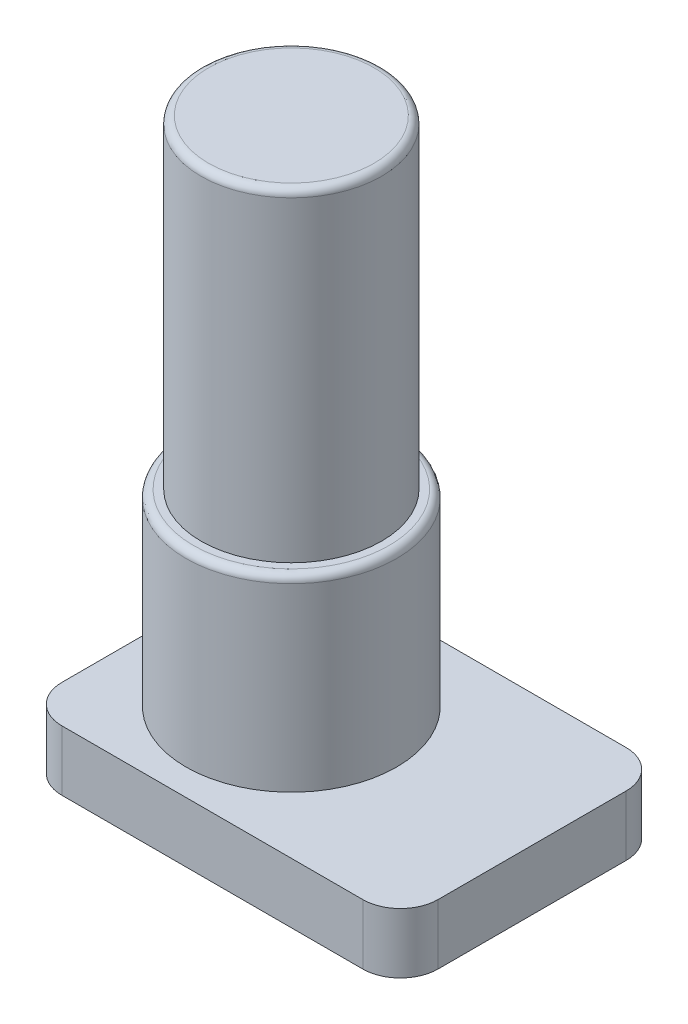
ISO-10303-21;
HEADER;
FILE_DESCRIPTION(('STEP AP214'),'2;1');
FILE_NAME('part.step','',(''),(''),'','','');
FILE_SCHEMA(('AUTOMOTIVE_DESIGN { 1 0 10303 214 1 1 1 1 }'));
ENDSEC;
DATA;
#1=APPLICATION_CONTEXT('core data for automotive mechanical design processes');
#2=APPLICATION_PROTOCOL_DEFINITION('international standard','automotive_design',2000,#1);
#3=PRODUCT_CONTEXT('',#1,'mechanical');
#4=PRODUCT('Part','Part','',(#3));
#5=PRODUCT_RELATED_PRODUCT_CATEGORY('part','',(#4));
#6=PRODUCT_DEFINITION_FORMATION('','',#4);
#7=PRODUCT_DEFINITION_CONTEXT('part definition',#1,'design');
#8=PRODUCT_DEFINITION('design','',#6,#7);
#9=PRODUCT_DEFINITION_SHAPE('','',#8);
#10=(LENGTH_UNIT() NAMED_UNIT(*) SI_UNIT(.MILLI.,.METRE.));
#11=(NAMED_UNIT(*) PLANE_ANGLE_UNIT() SI_UNIT($,.RADIAN.));
#12=(NAMED_UNIT(*) SI_UNIT($,.STERADIAN.) SOLID_ANGLE_UNIT());
#13=UNCERTAINTY_MEASURE_WITH_UNIT(LENGTH_MEASURE(1.E-05),#10,'distance_accuracy_value','');
#14=(GEOMETRIC_REPRESENTATION_CONTEXT(3) GLOBAL_UNCERTAINTY_ASSIGNED_CONTEXT((#13)) GLOBAL_UNIT_ASSIGNED_CONTEXT((#10,
#11,#12)) REPRESENTATION_CONTEXT('',''));
#15=CARTESIAN_POINT('',(0.,0.,0.));
#16=DIRECTION('',(0.,0.,1.));
#17=DIRECTION('',(1.,0.,0.));
#18=AXIS2_PLACEMENT_3D('',#15,#16,#17);
#19=CARTESIAN_POINT('',(25.,8.,-17.5));
#20=DIRECTION('',(-1.,0.,0.));
#21=DIRECTION('',(0.,0.,1.));
#22=AXIS2_PLACEMENT_3D('',#19,#20,#21);
#23=PLANE('',#22);
#24=DIRECTION('',(0.,0.,-1.));
#25=VECTOR('',#24,1.);
#26=CARTESIAN_POINT('',(25.,0.,-17.5));
#27=LINE('',#26,#25);
#28=CARTESIAN_POINT('',(25.,0.,12.5));
#29=VERTEX_POINT('',#28);
#30=CARTESIAN_POINT('',(25.,0.,-12.5));
#31=VERTEX_POINT('',#30);
#32=EDGE_CURVE('E131',#29,#31,#27,.T.);
#33=ORIENTED_EDGE('',*,*,#32,.T.);
#34=DIRECTION('',(0.,-1.,0.));
#35=VECTOR('',#34,1.);
#36=CARTESIAN_POINT('',(25.,8.,-12.5));
#37=LINE('',#36,#35);
#38=CARTESIAN_POINT('',(25.,8.,-12.5));
#39=VERTEX_POINT('',#38);
#40=EDGE_CURVE('E158',#31,#39,#37,.F.);
#41=ORIENTED_EDGE('',*,*,#40,.T.);
#42=DIRECTION('',(0.,0.,-1.));
#43=VECTOR('',#42,1.);
#44=CARTESIAN_POINT('',(25.,8.,-17.5));
#45=LINE('',#44,#43);
#46=CARTESIAN_POINT('',(25.,8.,12.5));
#47=VERTEX_POINT('',#46);
#48=EDGE_CURVE('E129',#47,#39,#45,.T.);
#49=ORIENTED_EDGE('',*,*,#48,.F.);
#50=DIRECTION('',(0.,-1.,0.));
#51=VECTOR('',#50,1.);
#52=CARTESIAN_POINT('',(25.,8.,12.5));
#53=LINE('',#52,#51);
#54=EDGE_CURVE('E155',#47,#29,#53,.T.);
#55=ORIENTED_EDGE('',*,*,#54,.T.);
#56=EDGE_LOOP('',(#33,#41,#49,#55));
#57=FACE_BOUND('',#56,.T.);
#58=ADVANCED_FACE('F34',(#57),#23,.F.);
#59=CARTESIAN_POINT('',(-25.,8.,-17.5));
#60=DIRECTION('',(0.,0.,1.));
#61=DIRECTION('',(1.,0.,0.));
#62=AXIS2_PLACEMENT_3D('',#59,#60,#61);
#63=PLANE('',#62);
#64=DIRECTION('',(-1.,0.,0.));
#65=VECTOR('',#64,1.);
#66=CARTESIAN_POINT('',(-25.,0.,-17.5));
#67=LINE('',#66,#65);
#68=CARTESIAN_POINT('',(20.,0.,-17.5));
#69=VERTEX_POINT('',#68);
#70=CARTESIAN_POINT('',(-20.,0.,-17.5));
#71=VERTEX_POINT('',#70);
#72=EDGE_CURVE('E127',#69,#71,#67,.T.);
#73=ORIENTED_EDGE('',*,*,#72,.T.);
#74=DIRECTION('',(0.,-1.,0.));
#75=VECTOR('',#74,1.);
#76=CARTESIAN_POINT('',(-20.,8.,-17.5));
#77=LINE('',#76,#75);
#78=CARTESIAN_POINT('',(-20.,8.,-17.5));
#79=VERTEX_POINT('',#78);
#80=EDGE_CURVE('E106',#71,#79,#77,.F.);
#81=ORIENTED_EDGE('',*,*,#80,.T.);
#82=DIRECTION('',(-1.,0.,0.));
#83=VECTOR('',#82,1.);
#84=CARTESIAN_POINT('',(-25.,8.,-17.5));
#85=LINE('',#84,#83);
#86=CARTESIAN_POINT('',(20.,8.,-17.5));
#87=VERTEX_POINT('',#86);
#88=EDGE_CURVE('E215',#87,#79,#85,.T.);
#89=ORIENTED_EDGE('',*,*,#88,.F.);
#90=DIRECTION('',(0.,-1.,0.));
#91=VECTOR('',#90,1.);
#92=CARTESIAN_POINT('',(20.,8.,-17.5));
#93=LINE('',#92,#91);
#94=EDGE_CURVE('E111',#87,#69,#93,.T.);
#95=ORIENTED_EDGE('',*,*,#94,.T.);
#96=EDGE_LOOP('',(#73,#81,#89,#95));
#97=FACE_BOUND('',#96,.T.);
#98=ADVANCED_FACE('F180',(#97),#63,.F.);
#99=CARTESIAN_POINT('',(-25.,8.,-17.5));
#100=DIRECTION('',(1.,0.,0.));
#101=DIRECTION('',(0.,0.,-1.));
#102=AXIS2_PLACEMENT_3D('',#99,#100,#101);
#103=PLANE('',#102);
#104=DIRECTION('',(0.,0.,1.));
#105=VECTOR('',#104,1.);
#106=CARTESIAN_POINT('',(-25.,8.,-17.5));
#107=LINE('',#106,#105);
#108=CARTESIAN_POINT('',(-25.,8.,-12.5));
#109=VERTEX_POINT('',#108);
#110=CARTESIAN_POINT('',(-25.,8.,12.5));
#111=VERTEX_POINT('',#110);
#112=EDGE_CURVE('E120',#109,#111,#107,.T.);
#113=ORIENTED_EDGE('',*,*,#112,.F.);
#114=DIRECTION('',(0.,-1.,0.));
#115=VECTOR('',#114,1.);
#116=CARTESIAN_POINT('',(-25.,8.,-12.5));
#117=LINE('',#116,#115);
#118=CARTESIAN_POINT('',(-25.,0.,-12.5));
#119=VERTEX_POINT('',#118);
#120=EDGE_CURVE('E105',#109,#119,#117,.T.);
#121=ORIENTED_EDGE('',*,*,#120,.T.);
#122=DIRECTION('',(0.,0.,1.));
#123=VECTOR('',#122,1.);
#124=CARTESIAN_POINT('',(-25.,0.,-17.5));
#125=LINE('',#124,#123);
#126=CARTESIAN_POINT('',(-25.,0.,12.5));
#127=VERTEX_POINT('',#126);
#128=EDGE_CURVE('E118',#119,#127,#125,.T.);
#129=ORIENTED_EDGE('',*,*,#128,.T.);
#130=DIRECTION('',(0.,-1.,0.));
#131=VECTOR('',#130,1.);
#132=CARTESIAN_POINT('',(-25.,8.,12.5));
#133=LINE('',#132,#131);
#134=EDGE_CURVE('E122',#127,#111,#133,.F.);
#135=ORIENTED_EDGE('',*,*,#134,.T.);
#136=EDGE_LOOP('',(#113,#121,#129,#135));
#137=FACE_BOUND('',#136,.T.);
#138=ADVANCED_FACE('F117',(#137),#103,.F.);
#139=CARTESIAN_POINT('',(-25.,8.,17.5));
#140=DIRECTION('',(0.,0.,-1.));
#141=DIRECTION('',(-1.,0.,0.));
#142=AXIS2_PLACEMENT_3D('',#139,#140,#141);
#143=PLANE('',#142);
#144=DIRECTION('',(1.,0.,0.));
#145=VECTOR('',#144,1.);
#146=CARTESIAN_POINT('',(-25.,8.,17.5));
#147=LINE('',#146,#145);
#148=CARTESIAN_POINT('',(-20.,8.,17.5));
#149=VERTEX_POINT('',#148);
#150=CARTESIAN_POINT('',(20.,8.,17.5));
#151=VERTEX_POINT('',#150);
#152=EDGE_CURVE('E212',#149,#151,#147,.T.);
#153=ORIENTED_EDGE('',*,*,#152,.F.);
#154=DIRECTION('',(0.,-1.,0.));
#155=VECTOR('',#154,1.);
#156=CARTESIAN_POINT('',(-20.,8.,17.5));
#157=LINE('',#156,#155);
#158=CARTESIAN_POINT('',(-20.,0.,17.5));
#159=VERTEX_POINT('',#158);
#160=EDGE_CURVE('E152',#149,#159,#157,.T.);
#161=ORIENTED_EDGE('',*,*,#160,.T.);
#162=DIRECTION('',(1.,0.,0.));
#163=VECTOR('',#162,1.);
#164=CARTESIAN_POINT('',(-25.,0.,17.5));
#165=LINE('',#164,#163);
#166=CARTESIAN_POINT('',(20.,0.,17.5));
#167=VERTEX_POINT('',#166);
#168=EDGE_CURVE('E126',#159,#167,#165,.T.);
#169=ORIENTED_EDGE('',*,*,#168,.T.);
#170=DIRECTION('',(0.,-1.,0.));
#171=VECTOR('',#170,1.);
#172=CARTESIAN_POINT('',(20.,8.,17.5));
#173=LINE('',#172,#171);
#174=EDGE_CURVE('E49',#167,#151,#173,.F.);
#175=ORIENTED_EDGE('',*,*,#174,.T.);
#176=EDGE_LOOP('',(#153,#161,#169,#175));
#177=FACE_BOUND('',#176,.T.);
#178=ADVANCED_FACE('F226',(#177),#143,.F.);
#179=CARTESIAN_POINT('',(0.,8.,0.));
#180=DIRECTION('',(0.,1.,0.));
#181=DIRECTION('',(0.,0.,1.));
#182=AXIS2_PLACEMENT_3D('',#179,#180,#181);
#183=PLANE('',#182);
#184=CARTESIAN_POINT('',(-6.99999999999999,8.,0.));
#185=DIRECTION('',(0.,1.,0.));
#186=DIRECTION('',(0.,0.,1.));
#187=AXIS2_PLACEMENT_3D('',#184,#185,#186);
#188=CIRCLE('',#187,14.);
#189=CARTESIAN_POINT('',(-6.99999999999999,8.,14.));
#190=VERTEX_POINT('',#189);
#191=EDGE_CURVE('E219',#190,#190,#188,.T.);
#192=ORIENTED_EDGE('',*,*,#191,.F.);
#193=EDGE_LOOP('',(#192));
#194=FACE_BOUND('',#193,.T.);
#195=ORIENTED_EDGE('',*,*,#88,.T.);
#196=CARTESIAN_POINT('',(-20.,8.,-12.5));
#197=DIRECTION('',(0.,1.,0.));
#198=DIRECTION('',(0.,0.,1.));
#199=AXIS2_PLACEMENT_3D('',#196,#197,#198);
#200=CIRCLE('',#199,5.);
#201=EDGE_CURVE('E149',#79,#109,#200,.T.);
#202=ORIENTED_EDGE('',*,*,#201,.T.);
#203=ORIENTED_EDGE('',*,*,#112,.T.);
#204=CARTESIAN_POINT('',(-20.,8.,12.5));
#205=DIRECTION('',(0.,1.,0.));
#206=DIRECTION('',(0.,0.,1.));
#207=AXIS2_PLACEMENT_3D('',#204,#205,#206);
#208=CIRCLE('',#207,5.);
#209=EDGE_CURVE('E56',#111,#149,#208,.T.);
#210=ORIENTED_EDGE('',*,*,#209,.T.);
#211=ORIENTED_EDGE('',*,*,#152,.T.);
#212=CARTESIAN_POINT('',(20.,8.,12.5));
#213=DIRECTION('',(0.,1.,0.));
#214=DIRECTION('',(0.,0.,1.));
#215=AXIS2_PLACEMENT_3D('',#212,#213,#214);
#216=CIRCLE('',#215,5.);
#217=EDGE_CURVE('E144',#151,#47,#216,.T.);
#218=ORIENTED_EDGE('',*,*,#217,.T.);
#219=ORIENTED_EDGE('',*,*,#48,.T.);
#220=CARTESIAN_POINT('',(20.,8.,-12.5));
#221=DIRECTION('',(0.,1.,0.));
#222=DIRECTION('',(0.,0.,1.));
#223=AXIS2_PLACEMENT_3D('',#220,#221,#222);
#224=CIRCLE('',#223,5.);
#225=EDGE_CURVE('E146',#39,#87,#224,.T.);
#226=ORIENTED_EDGE('',*,*,#225,.T.);
#227=EDGE_LOOP('',(#195,#202,#203,#210,#211,#218,#219,#226));
#228=FACE_BOUND('',#227,.T.);
#229=ADVANCED_FACE('F210',(#194,#228),#183,.T.);
#230=CARTESIAN_POINT('',(0.,0.,0.));
#231=DIRECTION('',(0.,1.,0.));
#232=DIRECTION('',(0.,0.,1.));
#233=AXIS2_PLACEMENT_3D('',#230,#231,#232);
#234=PLANE('',#233);
#235=ORIENTED_EDGE('',*,*,#128,.F.);
#236=CARTESIAN_POINT('',(-20.,0.,-12.5));
#237=DIRECTION('',(0.,1.,0.));
#238=DIRECTION('',(0.,0.,1.));
#239=AXIS2_PLACEMENT_3D('',#236,#237,#238);
#240=CIRCLE('',#239,5.);
#241=EDGE_CURVE('E101',#119,#71,#240,.F.);
#242=ORIENTED_EDGE('',*,*,#241,.T.);
#243=ORIENTED_EDGE('',*,*,#72,.F.);
#244=CARTESIAN_POINT('',(20.,0.,-12.5));
#245=DIRECTION('',(0.,1.,0.));
#246=DIRECTION('',(0.,0.,1.));
#247=AXIS2_PLACEMENT_3D('',#244,#245,#246);
#248=CIRCLE('',#247,5.);
#249=EDGE_CURVE('E138',#69,#31,#248,.F.);
#250=ORIENTED_EDGE('',*,*,#249,.T.);
#251=ORIENTED_EDGE('',*,*,#32,.F.);
#252=CARTESIAN_POINT('',(20.,0.,12.5));
#253=DIRECTION('',(0.,1.,0.));
#254=DIRECTION('',(0.,0.,1.));
#255=AXIS2_PLACEMENT_3D('',#252,#253,#254);
#256=CIRCLE('',#255,5.);
#257=EDGE_CURVE('E121',#29,#167,#256,.F.);
#258=ORIENTED_EDGE('',*,*,#257,.T.);
#259=ORIENTED_EDGE('',*,*,#168,.F.);
#260=CARTESIAN_POINT('',(-20.,0.,12.5));
#261=DIRECTION('',(0.,1.,0.));
#262=DIRECTION('',(0.,0.,1.));
#263=AXIS2_PLACEMENT_3D('',#260,#261,#262);
#264=CIRCLE('',#263,5.);
#265=EDGE_CURVE('E112',#159,#127,#264,.F.);
#266=ORIENTED_EDGE('',*,*,#265,.T.);
#267=EDGE_LOOP('',(#235,#242,#243,#250,#251,#258,#259,#266));
#268=FACE_BOUND('',#267,.T.);
#269=ADVANCED_FACE('F124',(#268),#234,.F.);
#270=CARTESIAN_POINT('',(-6.99999999999999,33.,0.));
#271=DIRECTION('',(0.,-1.,0.));
#272=DIRECTION('',(0.,0.,-1.));
#273=AXIS2_PLACEMENT_3D('',#270,#271,#272);
#274=CYLINDRICAL_SURFACE('',#273,14.);
#275=CARTESIAN_POINT('',(-6.99999999999999,32.,0.));
#276=DIRECTION('',(0.,1.,0.));
#277=DIRECTION('',(0.,0.,1.));
#278=AXIS2_PLACEMENT_3D('',#275,#276,#277);
#279=CIRCLE('',#278,14.);
#280=CARTESIAN_POINT('',(-6.99999999999999,32.,14.));
#281=VERTEX_POINT('',#280);
#282=EDGE_CURVE('E163',#281,#281,#279,.F.);
#283=ORIENTED_EDGE('',*,*,#282,.T.);
#284=EDGE_LOOP('',(#283));
#285=FACE_BOUND('',#284,.T.);
#286=ORIENTED_EDGE('',*,*,#191,.T.);
#287=EDGE_LOOP('',(#286));
#288=FACE_BOUND('',#287,.T.);
#289=ADVANCED_FACE('F237',(#285,#288),#274,.T.);
#290=CARTESIAN_POINT('',(-6.99999999999999,33.,0.));
#291=DIRECTION('',(0.,1.,0.));
#292=DIRECTION('',(0.,0.,1.));
#293=AXIS2_PLACEMENT_3D('',#290,#291,#292);
#294=PLANE('',#293);
#295=CARTESIAN_POINT('',(-6.99999999999999,33.,0.));
#296=DIRECTION('',(0.,1.,0.));
#297=DIRECTION('',(0.,0.,1.));
#298=AXIS2_PLACEMENT_3D('',#295,#296,#297);
#299=CIRCLE('',#298,13.);
#300=CARTESIAN_POINT('',(-6.99999999999999,33.,13.));
#301=VERTEX_POINT('',#300);
#302=EDGE_CURVE('E160',#301,#301,#299,.T.);
#303=ORIENTED_EDGE('',*,*,#302,.T.);
#304=EDGE_LOOP('',(#303));
#305=FACE_BOUND('',#304,.T.);
#306=CARTESIAN_POINT('',(-6.99999999999999,33.,0.));
#307=DIRECTION('',(0.,1.,0.));
#308=DIRECTION('',(0.,0.,1.));
#309=AXIS2_PLACEMENT_3D('',#306,#307,#308);
#310=CIRCLE('',#309,12.);
#311=CARTESIAN_POINT('',(-6.99999999999999,33.,12.));
#312=VERTEX_POINT('',#311);
#313=EDGE_CURVE('E135',#312,#312,#310,.T.);
#314=ORIENTED_EDGE('',*,*,#313,.F.);
#315=EDGE_LOOP('',(#314));
#316=FACE_BOUND('',#315,.T.);
#317=ADVANCED_FACE('F241',(#305,#316),#294,.T.);
#318=CARTESIAN_POINT('',(-6.99999999999999,76.,0.));
#319=DIRECTION('',(0.,-1.,0.));
#320=DIRECTION('',(0.,0.,-1.));
#321=AXIS2_PLACEMENT_3D('',#318,#319,#320);
#322=CYLINDRICAL_SURFACE('',#321,12.);
#323=CARTESIAN_POINT('',(-6.99999999999999,75.,0.));
#324=DIRECTION('',(0.,1.,0.));
#325=DIRECTION('',(0.,0.,1.));
#326=AXIS2_PLACEMENT_3D('',#323,#324,#325);
#327=CIRCLE('',#326,12.);
#328=CARTESIAN_POINT('',(-6.99999999999999,75.,12.));
#329=VERTEX_POINT('',#328);
#330=EDGE_CURVE('E11',#329,#329,#327,.F.);
#331=ORIENTED_EDGE('',*,*,#330,.T.);
#332=EDGE_LOOP('',(#331));
#333=FACE_BOUND('',#332,.T.);
#334=ORIENTED_EDGE('',*,*,#313,.T.);
#335=EDGE_LOOP('',(#334));
#336=FACE_BOUND('',#335,.T.);
#337=ADVANCED_FACE('F245',(#333,#336),#322,.T.);
#338=CARTESIAN_POINT('',(-6.99999999999999,76.,0.));
#339=DIRECTION('',(0.,1.,0.));
#340=DIRECTION('',(0.,0.,1.));
#341=AXIS2_PLACEMENT_3D('',#338,#339,#340);
#342=PLANE('',#341);
#343=CARTESIAN_POINT('',(-6.99999999999999,76.,0.));
#344=DIRECTION('',(0.,1.,0.));
#345=DIRECTION('',(0.,0.,1.));
#346=AXIS2_PLACEMENT_3D('',#343,#344,#345);
#347=CIRCLE('',#346,11.);
#348=CARTESIAN_POINT('',(-6.99999999999999,76.,11.));
#349=VERTEX_POINT('',#348);
#350=EDGE_CURVE('E42',#349,#349,#347,.T.);
#351=ORIENTED_EDGE('',*,*,#350,.T.);
#352=EDGE_LOOP('',(#351));
#353=FACE_BOUND('',#352,.T.);
#354=ADVANCED_FACE('F168',(#353),#342,.T.);
#355=CARTESIAN_POINT('',(-20.,8.,-12.5));
#356=DIRECTION('',(0.,-1.,0.));
#357=DIRECTION('',(0.,0.,-1.));
#358=AXIS2_PLACEMENT_3D('',#355,#356,#357);
#359=CYLINDRICAL_SURFACE('',#358,5.);
#360=ORIENTED_EDGE('',*,*,#201,.F.);
#361=ORIENTED_EDGE('',*,*,#80,.F.);
#362=ORIENTED_EDGE('',*,*,#241,.F.);
#363=ORIENTED_EDGE('',*,*,#120,.F.);
#364=EDGE_LOOP('',(#360,#361,#362,#363));
#365=FACE_BOUND('',#364,.T.);
#366=ADVANCED_FACE('F104',(#365),#359,.T.);
#367=CARTESIAN_POINT('',(-20.,8.,12.5));
#368=DIRECTION('',(0.,-1.,0.));
#369=DIRECTION('',(0.,0.,-1.));
#370=AXIS2_PLACEMENT_3D('',#367,#368,#369);
#371=CYLINDRICAL_SURFACE('',#370,5.);
#372=ORIENTED_EDGE('',*,*,#209,.F.);
#373=ORIENTED_EDGE('',*,*,#134,.F.);
#374=ORIENTED_EDGE('',*,*,#265,.F.);
#375=ORIENTED_EDGE('',*,*,#160,.F.);
#376=EDGE_LOOP('',(#372,#373,#374,#375));
#377=FACE_BOUND('',#376,.T.);
#378=ADVANCED_FACE('F193',(#377),#371,.T.);
#379=CARTESIAN_POINT('',(20.,8.,-12.5));
#380=DIRECTION('',(0.,-1.,0.));
#381=DIRECTION('',(0.,0.,-1.));
#382=AXIS2_PLACEMENT_3D('',#379,#380,#381);
#383=CYLINDRICAL_SURFACE('',#382,5.);
#384=ORIENTED_EDGE('',*,*,#225,.F.);
#385=ORIENTED_EDGE('',*,*,#40,.F.);
#386=ORIENTED_EDGE('',*,*,#249,.F.);
#387=ORIENTED_EDGE('',*,*,#94,.F.);
#388=EDGE_LOOP('',(#384,#385,#386,#387));
#389=FACE_BOUND('',#388,.T.);
#390=ADVANCED_FACE('F196',(#389),#383,.T.);
#391=CARTESIAN_POINT('',(20.,8.,12.5));
#392=DIRECTION('',(0.,-1.,0.));
#393=DIRECTION('',(0.,0.,-1.));
#394=AXIS2_PLACEMENT_3D('',#391,#392,#393);
#395=CYLINDRICAL_SURFACE('',#394,5.);
#396=ORIENTED_EDGE('',*,*,#217,.F.);
#397=ORIENTED_EDGE('',*,*,#174,.F.);
#398=ORIENTED_EDGE('',*,*,#257,.F.);
#399=ORIENTED_EDGE('',*,*,#54,.F.);
#400=EDGE_LOOP('',(#396,#397,#398,#399));
#401=FACE_BOUND('',#400,.T.);
#402=ADVANCED_FACE('F176',(#401),#395,.T.);
#403=CARTESIAN_POINT('',(-6.99999999999999,32.,0.));
#404=DIRECTION('',(0.,1.,0.));
#405=DIRECTION('',(0.,0.,1.));
#406=AXIS2_PLACEMENT_3D('',#403,#404,#405);
#407=TOROIDAL_SURFACE('',#406,13.,1.);
#408=ORIENTED_EDGE('',*,*,#282,.F.);
#409=EDGE_LOOP('',(#408));
#410=FACE_BOUND('',#409,.T.);
#411=ORIENTED_EDGE('',*,*,#302,.F.);
#412=EDGE_LOOP('',(#411));
#413=FACE_BOUND('',#412,.T.);
#414=ADVANCED_FACE('F171',(#410,#413),#407,.T.);
#415=CARTESIAN_POINT('',(-6.99999999999999,75.,0.));
#416=DIRECTION('',(0.,1.,0.));
#417=DIRECTION('',(0.,0.,1.));
#418=AXIS2_PLACEMENT_3D('',#415,#416,#417);
#419=TOROIDAL_SURFACE('',#418,11.,1.);
#420=ORIENTED_EDGE('',*,*,#330,.F.);
#421=EDGE_LOOP('',(#420));
#422=FACE_BOUND('',#421,.T.);
#423=ORIENTED_EDGE('',*,*,#350,.F.);
#424=EDGE_LOOP('',(#423));
#425=FACE_BOUND('',#424,.T.);
#426=ADVANCED_FACE('F36',(#422,#425),#419,.T.);
#427=CLOSED_SHELL('',(#58,#98,#138,#178,#229,#269,#289,#317,#337,#354,#366,#378,#390,#402,#414,#426));
#428=MANIFOLD_SOLID_BREP('B2',#427);
#429=ADVANCED_BREP_SHAPE_REPRESENTATION('',(#18,#428),#14);
#430=SHAPE_DEFINITION_REPRESENTATION(#9,#429);
ENDSEC;
END-ISO-10303-21;
